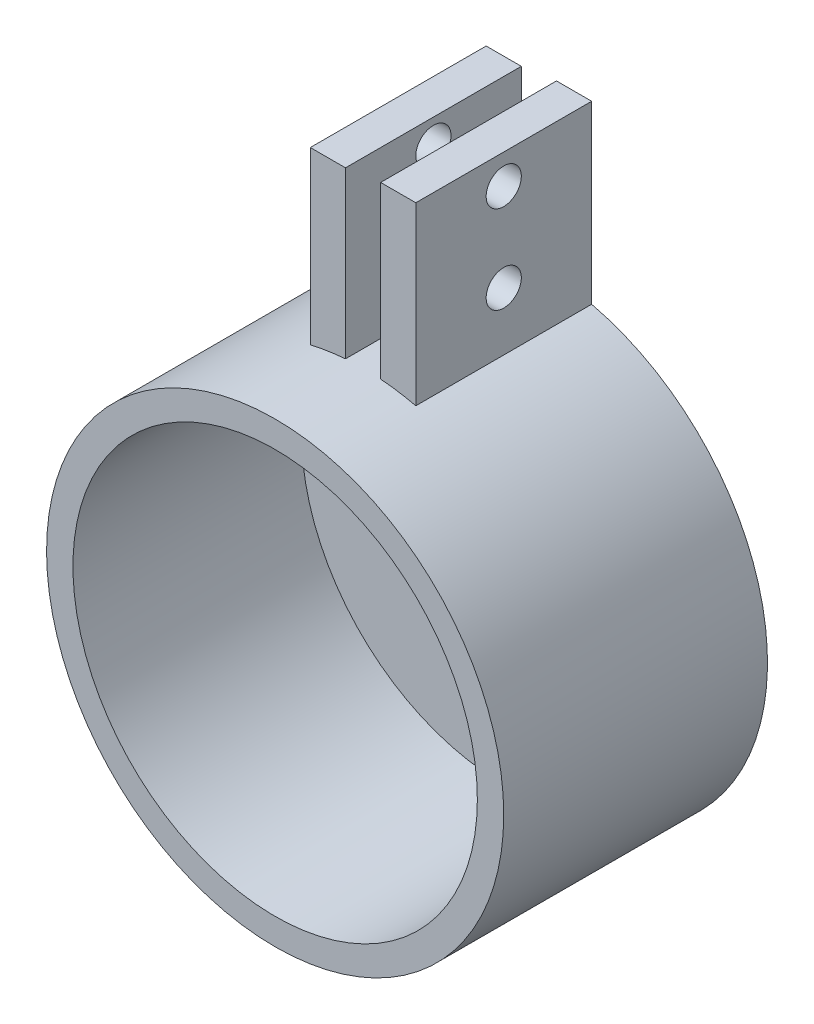
ISO-10303-21;
HEADER;
FILE_DESCRIPTION(('STEP AP214'),'2;1');
FILE_NAME('part.step','',(''),(''),'','','');
FILE_SCHEMA(('AUTOMOTIVE_DESIGN { 1 0 10303 214 1 1 1 1 }'));
ENDSEC;
DATA;
#1=APPLICATION_CONTEXT('core data for automotive mechanical design processes');
#2=APPLICATION_PROTOCOL_DEFINITION('international standard','automotive_design',2000,#1);
#3=PRODUCT_CONTEXT('',#1,'mechanical');
#4=PRODUCT('Part','Part','',(#3));
#5=PRODUCT_RELATED_PRODUCT_CATEGORY('part','',(#4));
#6=PRODUCT_DEFINITION_FORMATION('','',#4);
#7=PRODUCT_DEFINITION_CONTEXT('part definition',#1,'design');
#8=PRODUCT_DEFINITION('design','',#6,#7);
#9=PRODUCT_DEFINITION_SHAPE('','',#8);
#10=(LENGTH_UNIT() NAMED_UNIT(*) SI_UNIT(.MILLI.,.METRE.));
#11=(NAMED_UNIT(*) PLANE_ANGLE_UNIT() SI_UNIT($,.RADIAN.));
#12=(NAMED_UNIT(*) SI_UNIT($,.STERADIAN.) SOLID_ANGLE_UNIT());
#13=UNCERTAINTY_MEASURE_WITH_UNIT(LENGTH_MEASURE(1.E-05),#10,'distance_accuracy_value','');
#14=(GEOMETRIC_REPRESENTATION_CONTEXT(3) GLOBAL_UNCERTAINTY_ASSIGNED_CONTEXT((#13)) GLOBAL_UNIT_ASSIGNED_CONTEXT((#10,
#11,#12)) REPRESENTATION_CONTEXT('',''));
#15=CARTESIAN_POINT('',(0.,0.,0.));
#16=DIRECTION('',(0.,0.,1.));
#17=DIRECTION('',(1.,0.,0.));
#18=AXIS2_PLACEMENT_3D('',#15,#16,#17);
#19=CARTESIAN_POINT('',(0.,0.,15.));
#20=DIRECTION('',(0.,0.,-1.));
#21=DIRECTION('',(-1.,0.,0.));
#22=AXIS2_PLACEMENT_3D('',#19,#20,#21);
#23=CYLINDRICAL_SURFACE('',#22,13.);
#24=CARTESIAN_POINT('',(0.,0.,15.));
#25=DIRECTION('',(0.,0.,1.));
#26=DIRECTION('',(1.,0.,0.));
#27=AXIS2_PLACEMENT_3D('',#24,#25,#26);
#28=CIRCLE('',#27,13.);
#29=CARTESIAN_POINT('',(13.,0.,15.));
#30=VERTEX_POINT('',#29);
#31=EDGE_CURVE('E184',#30,#30,#28,.T.);
#32=ORIENTED_EDGE('',*,*,#31,.F.);
#33=EDGE_LOOP('',(#32));
#34=FACE_BOUND('',#33,.T.);
#35=DIRECTION('',(0.,0.,-1.));
#36=VECTOR('',#35,1.);
#37=CARTESIAN_POINT('',(-3.,12.6491106406735,10.));
#38=LINE('',#37,#36);
#39=CARTESIAN_POINT('',(-3.,12.6491106406735,10.));
#40=VERTEX_POINT('',#39);
#41=CARTESIAN_POINT('',(-3.,12.6491106406735,0.));
#42=VERTEX_POINT('',#41);
#43=EDGE_CURVE('E126',#40,#42,#38,.T.);
#44=ORIENTED_EDGE('',*,*,#43,.T.);
#45=CARTESIAN_POINT('',(0.,0.,0.));
#46=DIRECTION('',(0.,0.,1.));
#47=DIRECTION('',(1.,0.,0.));
#48=AXIS2_PLACEMENT_3D('',#45,#46,#47);
#49=CIRCLE('',#48,13.);
#50=CARTESIAN_POINT('',(3.,12.6491106406735,0.));
#51=VERTEX_POINT('',#50);
#52=EDGE_CURVE('E183',#42,#51,#49,.T.);
#53=ORIENTED_EDGE('',*,*,#52,.T.);
#54=DIRECTION('',(0.,0.,-1.));
#55=VECTOR('',#54,1.);
#56=CARTESIAN_POINT('',(3.,12.6491106406735,10.));
#57=LINE('',#56,#55);
#58=CARTESIAN_POINT('',(3.,12.6491106406735,10.));
#59=VERTEX_POINT('',#58);
#60=EDGE_CURVE('E168',#59,#51,#57,.T.);
#61=ORIENTED_EDGE('',*,*,#60,.F.);
#62=CARTESIAN_POINT('',(0.,0.,10.));
#63=DIRECTION('',(0.,0.,1.));
#64=DIRECTION('',(1.,0.,0.));
#65=AXIS2_PLACEMENT_3D('',#62,#63,#64);
#66=CIRCLE('',#65,13.);
#67=CARTESIAN_POINT('',(1.,12.9614813968157,10.));
#68=VERTEX_POINT('',#67);
#69=EDGE_CURVE('E195',#59,#68,#66,.T.);
#70=ORIENTED_EDGE('',*,*,#69,.T.);
#71=DIRECTION('',(0.,0.,-1.));
#72=VECTOR('',#71,1.);
#73=CARTESIAN_POINT('',(1.,12.9614813968157,15.));
#74=LINE('',#73,#72);
#75=CARTESIAN_POINT('',(1.,12.9614813968157,0.));
#76=VERTEX_POINT('',#75);
#77=EDGE_CURVE('E198',#68,#76,#74,.T.);
#78=ORIENTED_EDGE('',*,*,#77,.T.);
#79=CARTESIAN_POINT('',(-1.,12.9614813968157,0.));
#80=VERTEX_POINT('',#79);
#81=EDGE_CURVE('E189',#76,#80,#49,.T.);
#82=ORIENTED_EDGE('',*,*,#81,.T.);
#83=DIRECTION('',(0.,0.,-1.));
#84=VECTOR('',#83,1.);
#85=CARTESIAN_POINT('',(-1.,12.9614813968157,15.));
#86=LINE('',#85,#84);
#87=CARTESIAN_POINT('',(-1.,12.9614813968157,10.));
#88=VERTEX_POINT('',#87);
#89=EDGE_CURVE('E11',#88,#80,#86,.T.);
#90=ORIENTED_EDGE('',*,*,#89,.F.);
#91=CARTESIAN_POINT('',(0.,0.,10.));
#92=DIRECTION('',(0.,0.,1.));
#93=DIRECTION('',(1.,0.,0.));
#94=AXIS2_PLACEMENT_3D('',#91,#92,#93);
#95=CIRCLE('',#94,13.);
#96=EDGE_CURVE('E48',#88,#40,#95,.T.);
#97=ORIENTED_EDGE('',*,*,#96,.T.);
#98=EDGE_LOOP('',(#44,#53,#61,#70,#78,#82,#90,#97));
#99=FACE_BOUND('',#98,.T.);
#100=ADVANCED_FACE('F39',(#34,#99),#23,.T.);
#101=CARTESIAN_POINT('',(0.,0.,15.));
#102=DIRECTION('',(0.,0.,1.));
#103=DIRECTION('',(1.,0.,0.));
#104=AXIS2_PLACEMENT_3D('',#101,#102,#103);
#105=PLANE('',#104);
#106=ORIENTED_EDGE('',*,*,#31,.T.);
#107=EDGE_LOOP('',(#106));
#108=FACE_BOUND('',#107,.T.);
#109=CARTESIAN_POINT('',(0.,0.,15.));
#110=DIRECTION('',(0.,0.,1.));
#111=DIRECTION('',(1.,0.,0.));
#112=AXIS2_PLACEMENT_3D('',#109,#110,#111);
#113=CIRCLE('',#112,11.5);
#114=CARTESIAN_POINT('',(11.5,0.,15.));
#115=VERTEX_POINT('',#114);
#116=EDGE_CURVE('E172',#115,#115,#113,.T.);
#117=ORIENTED_EDGE('',*,*,#116,.F.);
#118=EDGE_LOOP('',(#117));
#119=FACE_BOUND('',#118,.T.);
#120=ADVANCED_FACE('F276',(#108,#119),#105,.T.);
#121=CARTESIAN_POINT('',(0.,0.,0.));
#122=DIRECTION('',(0.,0.,1.));
#123=DIRECTION('',(1.,0.,0.));
#124=AXIS2_PLACEMENT_3D('',#121,#122,#123);
#125=PLANE('',#124);
#126=ORIENTED_EDGE('',*,*,#52,.F.);
#127=DIRECTION('',(0.,1.,0.));
#128=VECTOR('',#127,1.);
#129=CARTESIAN_POINT('',(-3.,12.6491106406735,0.));
#130=LINE('',#129,#128);
#131=CARTESIAN_POINT('',(-3.,22.369316876853,0.));
#132=VERTEX_POINT('',#131);
#133=EDGE_CURVE('E138',#42,#132,#130,.T.);
#134=ORIENTED_EDGE('',*,*,#133,.T.);
#135=DIRECTION('',(-1.,0.,0.));
#136=VECTOR('',#135,1.);
#137=CARTESIAN_POINT('',(-1.,22.369316876853,0.));
#138=LINE('',#137,#136);
#139=CARTESIAN_POINT('',(-1.,22.369316876853,0.));
#140=VERTEX_POINT('',#139);
#141=EDGE_CURVE('E118',#140,#132,#138,.T.);
#142=ORIENTED_EDGE('',*,*,#141,.F.);
#143=DIRECTION('',(0.,1.,0.));
#144=VECTOR('',#143,1.);
#145=CARTESIAN_POINT('',(-1.,12.6491106406735,0.));
#146=LINE('',#145,#144);
#147=EDGE_CURVE('E128',#80,#140,#146,.T.);
#148=ORIENTED_EDGE('',*,*,#147,.F.);
#149=ORIENTED_EDGE('',*,*,#81,.F.);
#150=DIRECTION('',(0.,1.,0.));
#151=VECTOR('',#150,1.);
#152=CARTESIAN_POINT('',(1.,12.6491106406735,0.));
#153=LINE('',#152,#151);
#154=CARTESIAN_POINT('',(1.,22.6491106406735,0.));
#155=VERTEX_POINT('',#154);
#156=EDGE_CURVE('E145',#76,#155,#153,.T.);
#157=ORIENTED_EDGE('',*,*,#156,.T.);
#158=DIRECTION('',(-1.,0.,0.));
#159=VECTOR('',#158,1.);
#160=CARTESIAN_POINT('',(3.,22.6491106406735,0.));
#161=LINE('',#160,#159);
#162=CARTESIAN_POINT('',(3.,22.6491106406735,0.));
#163=VERTEX_POINT('',#162);
#164=EDGE_CURVE('E162',#163,#155,#161,.T.);
#165=ORIENTED_EDGE('',*,*,#164,.F.);
#166=DIRECTION('',(0.,1.,0.));
#167=VECTOR('',#166,1.);
#168=CARTESIAN_POINT('',(3.,12.6491106406735,0.));
#169=LINE('',#168,#167);
#170=EDGE_CURVE('E152',#51,#163,#169,.T.);
#171=ORIENTED_EDGE('',*,*,#170,.F.);
#172=EDGE_LOOP('',(#126,#134,#142,#148,#149,#157,#165,#171));
#173=FACE_BOUND('',#172,.T.);
#174=ADVANCED_FACE('F261',(#173),#125,.F.);
#175=CARTESIAN_POINT('',(0.,0.,15.));
#176=DIRECTION('',(0.,0.,-1.));
#177=DIRECTION('',(-1.,0.,0.));
#178=AXIS2_PLACEMENT_3D('',#175,#176,#177);
#179=CYLINDRICAL_SURFACE('',#178,11.5);
#180=CARTESIAN_POINT('',(0.,0.,2.));
#181=DIRECTION('',(0.,0.,1.));
#182=DIRECTION('',(1.,0.,0.));
#183=AXIS2_PLACEMENT_3D('',#180,#181,#182);
#184=CIRCLE('',#183,11.5);
#185=CARTESIAN_POINT('',(11.5,0.,2.));
#186=VERTEX_POINT('',#185);
#187=EDGE_CURVE('E188',#186,#186,#184,.T.);
#188=ORIENTED_EDGE('',*,*,#187,.F.);
#189=EDGE_LOOP('',(#188));
#190=FACE_BOUND('',#189,.T.);
#191=ORIENTED_EDGE('',*,*,#116,.T.);
#192=EDGE_LOOP('',(#191));
#193=FACE_BOUND('',#192,.T.);
#194=ADVANCED_FACE('F287',(#190,#193),#179,.F.);
#195=CARTESIAN_POINT('',(0.,0.,2.));
#196=DIRECTION('',(0.,0.,1.));
#197=DIRECTION('',(1.,0.,0.));
#198=AXIS2_PLACEMENT_3D('',#195,#196,#197);
#199=PLANE('',#198);
#200=ORIENTED_EDGE('',*,*,#187,.T.);
#201=EDGE_LOOP('',(#200));
#202=FACE_BOUND('',#201,.T.);
#203=ADVANCED_FACE('F242',(#202),#199,.T.);
#204=CARTESIAN_POINT('',(1.,12.6491106406735,10.));
#205=DIRECTION('',(-1.,0.,0.));
#206=DIRECTION('',(0.,0.,1.));
#207=AXIS2_PLACEMENT_3D('',#204,#205,#206);
#208=PLANE('',#207);
#209=CARTESIAN_POINT('',(1.,15.9614813968157,5.));
#210=DIRECTION('',(-1.,0.,0.));
#211=DIRECTION('',(0.,0.,1.));
#212=AXIS2_PLACEMENT_3D('',#209,#210,#211);
#213=CIRCLE('',#212,1.);
#214=CARTESIAN_POINT('',(1.,15.9614813968157,6.));
#215=VERTEX_POINT('',#214);
#216=EDGE_CURVE('E133',#215,#215,#213,.T.);
#217=ORIENTED_EDGE('',*,*,#216,.F.);
#218=EDGE_LOOP('',(#217));
#219=FACE_BOUND('',#218,.T.);
#220=CARTESIAN_POINT('',(1.,20.9614813968157,5.));
#221=DIRECTION('',(-1.,0.,0.));
#222=DIRECTION('',(0.,0.,1.));
#223=AXIS2_PLACEMENT_3D('',#220,#221,#222);
#224=CIRCLE('',#223,1.);
#225=CARTESIAN_POINT('',(1.,20.9614813968157,6.));
#226=VERTEX_POINT('',#225);
#227=EDGE_CURVE('E217',#226,#226,#224,.T.);
#228=ORIENTED_EDGE('',*,*,#227,.F.);
#229=EDGE_LOOP('',(#228));
#230=FACE_BOUND('',#229,.T.);
#231=ORIENTED_EDGE('',*,*,#77,.F.);
#232=DIRECTION('',(0.,1.,0.));
#233=VECTOR('',#232,1.);
#234=CARTESIAN_POINT('',(1.,12.6491106406735,10.));
#235=LINE('',#234,#233);
#236=CARTESIAN_POINT('',(1.,22.6491106406735,10.));
#237=VERTEX_POINT('',#236);
#238=EDGE_CURVE('E148',#68,#237,#235,.T.);
#239=ORIENTED_EDGE('',*,*,#238,.T.);
#240=DIRECTION('',(0.,0.,-1.));
#241=VECTOR('',#240,1.);
#242=CARTESIAN_POINT('',(1.,22.6491106406735,10.));
#243=LINE('',#242,#241);
#244=EDGE_CURVE('E159',#237,#155,#243,.T.);
#245=ORIENTED_EDGE('',*,*,#244,.T.);
#246=ORIENTED_EDGE('',*,*,#156,.F.);
#247=EDGE_LOOP('',(#231,#239,#245,#246));
#248=FACE_BOUND('',#247,.T.);
#249=ADVANCED_FACE('F238',(#219,#230,#248),#208,.T.);
#250=CARTESIAN_POINT('',(3.,12.6491106406735,10.));
#251=DIRECTION('',(-1.,0.,0.));
#252=DIRECTION('',(0.,0.,1.));
#253=AXIS2_PLACEMENT_3D('',#250,#251,#252);
#254=PLANE('',#253);
#255=CARTESIAN_POINT('',(3.,15.9614813968157,5.));
#256=DIRECTION('',(-1.,0.,0.));
#257=DIRECTION('',(0.,0.,1.));
#258=AXIS2_PLACEMENT_3D('',#255,#256,#257);
#259=CIRCLE('',#258,1.);
#260=CARTESIAN_POINT('',(3.,15.9614813968157,6.));
#261=VERTEX_POINT('',#260);
#262=EDGE_CURVE('E226',#261,#261,#259,.T.);
#263=ORIENTED_EDGE('',*,*,#262,.T.);
#264=EDGE_LOOP('',(#263));
#265=FACE_BOUND('',#264,.T.);
#266=CARTESIAN_POINT('',(3.,20.9614813968157,5.));
#267=DIRECTION('',(-1.,0.,0.));
#268=DIRECTION('',(0.,0.,1.));
#269=AXIS2_PLACEMENT_3D('',#266,#267,#268);
#270=CIRCLE('',#269,1.);
#271=CARTESIAN_POINT('',(3.,20.9614813968157,6.));
#272=VERTEX_POINT('',#271);
#273=EDGE_CURVE('E211',#272,#272,#270,.T.);
#274=ORIENTED_EDGE('',*,*,#273,.T.);
#275=EDGE_LOOP('',(#274));
#276=FACE_BOUND('',#275,.T.);
#277=ORIENTED_EDGE('',*,*,#170,.T.);
#278=DIRECTION('',(0.,0.,-1.));
#279=VECTOR('',#278,1.);
#280=CARTESIAN_POINT('',(3.,22.6491106406735,10.));
#281=LINE('',#280,#279);
#282=CARTESIAN_POINT('',(3.,22.6491106406735,10.));
#283=VERTEX_POINT('',#282);
#284=EDGE_CURVE('E173',#283,#163,#281,.T.);
#285=ORIENTED_EDGE('',*,*,#284,.F.);
#286=DIRECTION('',(0.,1.,0.));
#287=VECTOR('',#286,1.);
#288=CARTESIAN_POINT('',(3.,12.6491106406735,10.));
#289=LINE('',#288,#287);
#290=EDGE_CURVE('E156',#59,#283,#289,.T.);
#291=ORIENTED_EDGE('',*,*,#290,.F.);
#292=ORIENTED_EDGE('',*,*,#60,.T.);
#293=EDGE_LOOP('',(#277,#285,#291,#292));
#294=FACE_BOUND('',#293,.T.);
#295=ADVANCED_FACE('F241',(#265,#276,#294),#254,.F.);
#296=CARTESIAN_POINT('',(3.,22.6491106406735,10.));
#297=DIRECTION('',(0.,-1.,0.));
#298=DIRECTION('',(0.,0.,-1.));
#299=AXIS2_PLACEMENT_3D('',#296,#297,#298);
#300=PLANE('',#299);
#301=ORIENTED_EDGE('',*,*,#164,.T.);
#302=ORIENTED_EDGE('',*,*,#244,.F.);
#303=DIRECTION('',(-1.,0.,0.));
#304=VECTOR('',#303,1.);
#305=CARTESIAN_POINT('',(3.,22.6491106406735,10.));
#306=LINE('',#305,#304);
#307=EDGE_CURVE('E151',#283,#237,#306,.T.);
#308=ORIENTED_EDGE('',*,*,#307,.F.);
#309=ORIENTED_EDGE('',*,*,#284,.T.);
#310=EDGE_LOOP('',(#301,#302,#308,#309));
#311=FACE_BOUND('',#310,.T.);
#312=ADVANCED_FACE('F257',(#311),#300,.F.);
#313=CARTESIAN_POINT('',(0.,0.,10.));
#314=DIRECTION('',(0.,0.,1.));
#315=DIRECTION('',(1.,0.,0.));
#316=AXIS2_PLACEMENT_3D('',#313,#314,#315);
#317=PLANE('',#316);
#318=ORIENTED_EDGE('',*,*,#69,.F.);
#319=ORIENTED_EDGE('',*,*,#290,.T.);
#320=ORIENTED_EDGE('',*,*,#307,.T.);
#321=ORIENTED_EDGE('',*,*,#238,.F.);
#322=EDGE_LOOP('',(#318,#319,#320,#321));
#323=FACE_BOUND('',#322,.T.);
#324=ADVANCED_FACE('F251',(#323),#317,.T.);
#325=CARTESIAN_POINT('',(-1.,12.6491106406735,10.));
#326=DIRECTION('',(-1.,0.,0.));
#327=DIRECTION('',(0.,0.,1.));
#328=AXIS2_PLACEMENT_3D('',#325,#326,#327);
#329=PLANE('',#328);
#330=CARTESIAN_POINT('',(-1.,15.9614813968157,5.));
#331=DIRECTION('',(-1.,0.,0.));
#332=DIRECTION('',(0.,0.,1.));
#333=AXIS2_PLACEMENT_3D('',#330,#331,#332);
#334=CIRCLE('',#333,1.);
#335=CARTESIAN_POINT('',(-1.,15.9614813968157,6.));
#336=VERTEX_POINT('',#335);
#337=EDGE_CURVE('E223',#336,#336,#334,.T.);
#338=ORIENTED_EDGE('',*,*,#337,.T.);
#339=EDGE_LOOP('',(#338));
#340=FACE_BOUND('',#339,.T.);
#341=CARTESIAN_POINT('',(-1.,20.9614813968157,5.));
#342=DIRECTION('',(-1.,0.,0.));
#343=DIRECTION('',(0.,0.,1.));
#344=AXIS2_PLACEMENT_3D('',#341,#342,#343);
#345=CIRCLE('',#344,1.);
#346=CARTESIAN_POINT('',(-1.,20.9614813968157,6.));
#347=VERTEX_POINT('',#346);
#348=EDGE_CURVE('E206',#347,#347,#345,.T.);
#349=ORIENTED_EDGE('',*,*,#348,.T.);
#350=EDGE_LOOP('',(#349));
#351=FACE_BOUND('',#350,.T.);
#352=DIRECTION('',(0.,1.,0.));
#353=VECTOR('',#352,1.);
#354=CARTESIAN_POINT('',(-1.,12.6491106406735,10.));
#355=LINE('',#354,#353);
#356=CARTESIAN_POINT('',(-1.,22.369316876853,10.));
#357=VERTEX_POINT('',#356);
#358=EDGE_CURVE('E108',#88,#357,#355,.T.);
#359=ORIENTED_EDGE('',*,*,#358,.F.);
#360=ORIENTED_EDGE('',*,*,#89,.T.);
#361=ORIENTED_EDGE('',*,*,#147,.T.);
#362=DIRECTION('',(0.,0.,-1.));
#363=VECTOR('',#362,1.);
#364=CARTESIAN_POINT('',(-1.,22.369316876853,10.));
#365=LINE('',#364,#363);
#366=EDGE_CURVE('E123',#357,#140,#365,.T.);
#367=ORIENTED_EDGE('',*,*,#366,.F.);
#368=EDGE_LOOP('',(#359,#360,#361,#367));
#369=FACE_BOUND('',#368,.T.);
#370=ADVANCED_FACE('F264',(#340,#351,#369),#329,.F.);
#371=CARTESIAN_POINT('',(-3.,12.6491106406735,10.));
#372=DIRECTION('',(-1.,0.,0.));
#373=DIRECTION('',(0.,0.,1.));
#374=AXIS2_PLACEMENT_3D('',#371,#372,#373);
#375=PLANE('',#374);
#376=CARTESIAN_POINT('',(-3.,15.9614813968157,5.));
#377=DIRECTION('',(-1.,0.,0.));
#378=DIRECTION('',(0.,0.,1.));
#379=AXIS2_PLACEMENT_3D('',#376,#377,#378);
#380=CIRCLE('',#379,1.);
#381=CARTESIAN_POINT('',(-3.,15.9614813968157,6.));
#382=VERTEX_POINT('',#381);
#383=EDGE_CURVE('E42',#382,#382,#380,.T.);
#384=ORIENTED_EDGE('',*,*,#383,.F.);
#385=EDGE_LOOP('',(#384));
#386=FACE_BOUND('',#385,.T.);
#387=CARTESIAN_POINT('',(-3.,20.9614813968157,5.));
#388=DIRECTION('',(-1.,0.,0.));
#389=DIRECTION('',(0.,0.,1.));
#390=AXIS2_PLACEMENT_3D('',#387,#388,#389);
#391=CIRCLE('',#390,1.);
#392=CARTESIAN_POINT('',(-3.,20.9614813968157,6.));
#393=VERTEX_POINT('',#392);
#394=EDGE_CURVE('E203',#393,#393,#391,.T.);
#395=ORIENTED_EDGE('',*,*,#394,.F.);
#396=EDGE_LOOP('',(#395));
#397=FACE_BOUND('',#396,.T.);
#398=ORIENTED_EDGE('',*,*,#133,.F.);
#399=ORIENTED_EDGE('',*,*,#43,.F.);
#400=DIRECTION('',(0.,1.,0.));
#401=VECTOR('',#400,1.);
#402=CARTESIAN_POINT('',(-3.,12.6491106406735,10.));
#403=LINE('',#402,#401);
#404=CARTESIAN_POINT('',(-3.,22.369316876853,10.));
#405=VERTEX_POINT('',#404);
#406=EDGE_CURVE('E106',#40,#405,#403,.T.);
#407=ORIENTED_EDGE('',*,*,#406,.T.);
#408=DIRECTION('',(0.,0.,-1.));
#409=VECTOR('',#408,1.);
#410=CARTESIAN_POINT('',(-3.,22.369316876853,10.));
#411=LINE('',#410,#409);
#412=EDGE_CURVE('E115',#405,#132,#411,.T.);
#413=ORIENTED_EDGE('',*,*,#412,.T.);
#414=EDGE_LOOP('',(#398,#399,#407,#413));
#415=FACE_BOUND('',#414,.T.);
#416=ADVANCED_FACE('F125',(#386,#397,#415),#375,.T.);
#417=CARTESIAN_POINT('',(-1.,22.369316876853,10.));
#418=DIRECTION('',(0.,-1.,0.));
#419=DIRECTION('',(0.,0.,-1.));
#420=AXIS2_PLACEMENT_3D('',#417,#418,#419);
#421=PLANE('',#420);
#422=ORIENTED_EDGE('',*,*,#141,.T.);
#423=ORIENTED_EDGE('',*,*,#412,.F.);
#424=DIRECTION('',(-1.,0.,0.));
#425=VECTOR('',#424,1.);
#426=CARTESIAN_POINT('',(-1.,22.369316876853,10.));
#427=LINE('',#426,#425);
#428=EDGE_CURVE('E102',#357,#405,#427,.T.);
#429=ORIENTED_EDGE('',*,*,#428,.F.);
#430=ORIENTED_EDGE('',*,*,#366,.T.);
#431=EDGE_LOOP('',(#422,#423,#429,#430));
#432=FACE_BOUND('',#431,.T.);
#433=ADVANCED_FACE('F116',(#432),#421,.F.);
#434=CARTESIAN_POINT('',(0.,0.,10.));
#435=DIRECTION('',(0.,0.,1.));
#436=DIRECTION('',(1.,0.,0.));
#437=AXIS2_PLACEMENT_3D('',#434,#435,#436);
#438=PLANE('',#437);
#439=ORIENTED_EDGE('',*,*,#96,.F.);
#440=ORIENTED_EDGE('',*,*,#358,.T.);
#441=ORIENTED_EDGE('',*,*,#428,.T.);
#442=ORIENTED_EDGE('',*,*,#406,.F.);
#443=EDGE_LOOP('',(#439,#440,#441,#442));
#444=FACE_BOUND('',#443,.T.);
#445=ADVANCED_FACE('F104',(#444),#438,.T.);
#446=CARTESIAN_POINT('',(13.,20.9614813968157,5.));
#447=DIRECTION('',(-1.,0.,0.));
#448=DIRECTION('',(0.,0.,1.));
#449=AXIS2_PLACEMENT_3D('',#446,#447,#448);
#450=CYLINDRICAL_SURFACE('',#449,1.);
#451=ORIENTED_EDGE('',*,*,#394,.T.);
#452=EDGE_LOOP('',(#451));
#453=FACE_BOUND('',#452,.T.);
#454=ORIENTED_EDGE('',*,*,#348,.F.);
#455=EDGE_LOOP('',(#454));
#456=FACE_BOUND('',#455,.T.);
#457=ADVANCED_FACE('F374',(#453,#456),#450,.F.);
#458=CARTESIAN_POINT('',(13.,15.9614813968157,5.));
#459=DIRECTION('',(-1.,0.,0.));
#460=DIRECTION('',(0.,0.,1.));
#461=AXIS2_PLACEMENT_3D('',#458,#459,#460);
#462=CYLINDRICAL_SURFACE('',#461,1.);
#463=ORIENTED_EDGE('',*,*,#383,.T.);
#464=EDGE_LOOP('',(#463));
#465=FACE_BOUND('',#464,.T.);
#466=ORIENTED_EDGE('',*,*,#337,.F.);
#467=EDGE_LOOP('',(#466));
#468=FACE_BOUND('',#467,.T.);
#469=ADVANCED_FACE('F382',(#465,#468),#462,.F.);
#470=ORIENTED_EDGE('',*,*,#227,.T.);
#471=EDGE_LOOP('',(#470));
#472=FACE_BOUND('',#471,.T.);
#473=ORIENTED_EDGE('',*,*,#273,.F.);
#474=EDGE_LOOP('',(#473));
#475=FACE_BOUND('',#474,.T.);
#476=ADVANCED_FACE('F384',(#472,#475),#450,.F.);
#477=ORIENTED_EDGE('',*,*,#216,.T.);
#478=EDGE_LOOP('',(#477));
#479=FACE_BOUND('',#478,.T.);
#480=ORIENTED_EDGE('',*,*,#262,.F.);
#481=EDGE_LOOP('',(#480));
#482=FACE_BOUND('',#481,.T.);
#483=ADVANCED_FACE('F235',(#479,#482),#462,.F.);
#484=CLOSED_SHELL('',(#100,#120,#174,#194,#203,#249,#295,#312,#324,#370,#416,#433,#445,#457,
#469,#476,#483));
#485=MANIFOLD_SOLID_BREP('B2',#484);
#486=ADVANCED_BREP_SHAPE_REPRESENTATION('',(#18,#485),#14);
#487=SHAPE_DEFINITION_REPRESENTATION(#9,#486);
ENDSEC;
END-ISO-10303-21;
